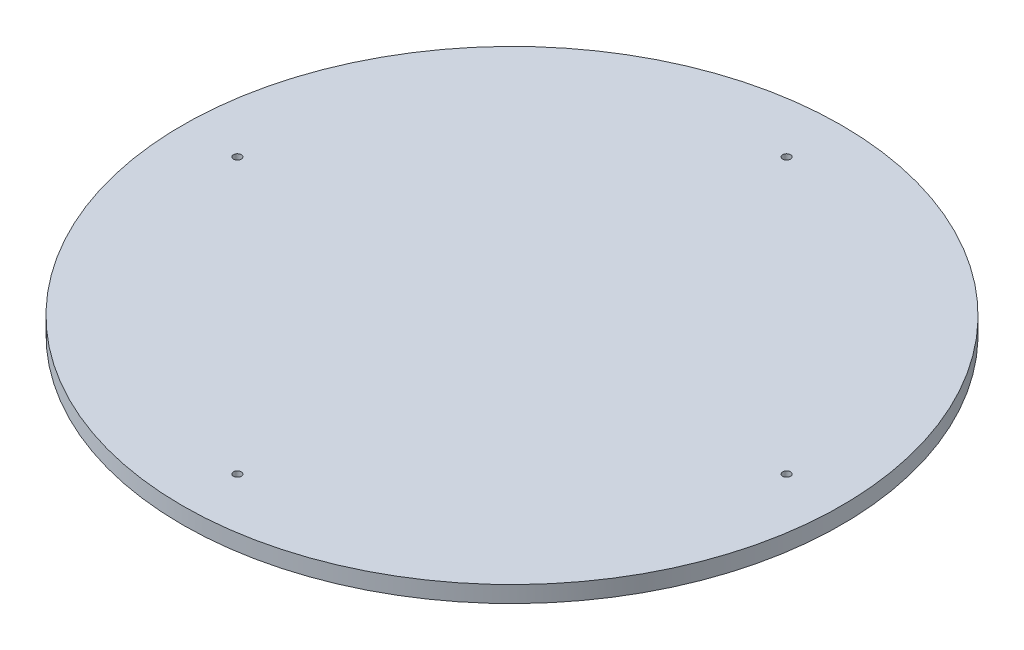
ISO-10303-21;
HEADER;
FILE_DESCRIPTION(('STEP AP214'),'2;1');
FILE_NAME('part.step','',(''),(''),'','','');
FILE_SCHEMA(('AUTOMOTIVE_DESIGN { 1 0 10303 214 1 1 1 1 }'));
ENDSEC;
DATA;
#1=APPLICATION_CONTEXT('core data for automotive mechanical design processes');
#2=APPLICATION_PROTOCOL_DEFINITION('international standard','automotive_design',2000,#1);
#3=PRODUCT_CONTEXT('',#1,'mechanical');
#4=PRODUCT('Part','Part','',(#3));
#5=PRODUCT_RELATED_PRODUCT_CATEGORY('part','',(#4));
#6=PRODUCT_DEFINITION_FORMATION('','',#4);
#7=PRODUCT_DEFINITION_CONTEXT('part definition',#1,'design');
#8=PRODUCT_DEFINITION('design','',#6,#7);
#9=PRODUCT_DEFINITION_SHAPE('','',#8);
#10=(LENGTH_UNIT() NAMED_UNIT(*) SI_UNIT(.MILLI.,.METRE.));
#11=(NAMED_UNIT(*) PLANE_ANGLE_UNIT() SI_UNIT($,.RADIAN.));
#12=(NAMED_UNIT(*) SI_UNIT($,.STERADIAN.) SOLID_ANGLE_UNIT());
#13=UNCERTAINTY_MEASURE_WITH_UNIT(LENGTH_MEASURE(1.E-05),#10,'distance_accuracy_value','');
#14=(GEOMETRIC_REPRESENTATION_CONTEXT(3) GLOBAL_UNCERTAINTY_ASSIGNED_CONTEXT((#13)) GLOBAL_UNIT_ASSIGNED_CONTEXT((#10,
#11,#12)) REPRESENTATION_CONTEXT('',''));
#15=CARTESIAN_POINT('',(0.,0.,0.));
#16=DIRECTION('',(0.,0.,1.));
#17=DIRECTION('',(1.,0.,0.));
#18=AXIS2_PLACEMENT_3D('',#15,#16,#17);
#19=CARTESIAN_POINT('',(0.,0.,0.));
#20=DIRECTION('',(0.,1.,0.));
#21=DIRECTION('',(0.,0.,1.));
#22=AXIS2_PLACEMENT_3D('',#19,#20,#21);
#23=PLANE('',#22);
#24=CARTESIAN_POINT('',(0.,0.,-250.));
#25=DIRECTION('',(0.,-1.,0.));
#26=DIRECTION('',(0.,0.,-1.));
#27=AXIS2_PLACEMENT_3D('',#24,#25,#26);
#28=CIRCLE('',#27,5.55625);
#29=CARTESIAN_POINT('',(0.,0.,-255.55625));
#30=VERTEX_POINT('',#29);
#31=EDGE_CURVE('E94',#30,#30,#28,.T.);
#32=ORIENTED_EDGE('',*,*,#31,.F.);
#33=EDGE_LOOP('',(#32));
#34=FACE_BOUND('',#33,.T.);
#35=CARTESIAN_POINT('',(250.000000000011,0.,-1.06122167814335E-11));
#36=DIRECTION('',(0.,-1.,0.));
#37=DIRECTION('',(0.,0.,-1.));
#38=AXIS2_PLACEMENT_3D('',#35,#36,#37);
#39=CIRCLE('',#38,5.55624999999998);
#40=CARTESIAN_POINT('',(250.000000000011,0.,-5.5562500000106));
#41=VERTEX_POINT('',#40);
#42=EDGE_CURVE('E82',#41,#41,#39,.T.);
#43=ORIENTED_EDGE('',*,*,#42,.F.);
#44=EDGE_LOOP('',(#43));
#45=FACE_BOUND('',#44,.T.);
#46=CARTESIAN_POINT('',(2.1224433562867E-11,0.,250.));
#47=DIRECTION('',(0.,-1.,0.));
#48=DIRECTION('',(0.,0.,-1.));
#49=AXIS2_PLACEMENT_3D('',#46,#47,#48);
#50=CIRCLE('',#49,5.55625);
#51=CARTESIAN_POINT('',(2.1224433562867E-11,0.,244.44375));
#52=VERTEX_POINT('',#51);
#53=EDGE_CURVE('E70',#52,#52,#50,.T.);
#54=ORIENTED_EDGE('',*,*,#53,.F.);
#55=EDGE_LOOP('',(#54));
#56=FACE_BOUND('',#55,.T.);
#57=CARTESIAN_POINT('',(0.,0.,0.));
#58=DIRECTION('',(0.,1.,0.));
#59=DIRECTION('',(0.,0.,1.));
#60=AXIS2_PLACEMENT_3D('',#57,#58,#59);
#61=CIRCLE('',#60,300.);
#62=CARTESIAN_POINT('',(0.,0.,300.));
#63=VERTEX_POINT('',#62);
#64=EDGE_CURVE('E41',#63,#63,#61,.T.);
#65=ORIENTED_EDGE('',*,*,#64,.F.);
#66=EDGE_LOOP('',(#65));
#67=FACE_BOUND('',#66,.T.);
#68=CARTESIAN_POINT('',(-249.999999999989,0.,1.05816006114548E-11));
#69=DIRECTION('',(0.,-1.,0.));
#70=DIRECTION('',(0.,0.,-1.));
#71=AXIS2_PLACEMENT_3D('',#68,#69,#70);
#72=CIRCLE('',#71,5.55625000000001);
#73=CARTESIAN_POINT('',(-249.999999999989,0.,-5.55624999998943));
#74=VERTEX_POINT('',#73);
#75=EDGE_CURVE('E58',#74,#74,#72,.T.);
#76=ORIENTED_EDGE('',*,*,#75,.F.);
#77=EDGE_LOOP('',(#76));
#78=FACE_BOUND('',#77,.T.);
#79=ADVANCED_FACE('F37',(#34,#45,#56,#67,#78),#23,.F.);
#80=CARTESIAN_POINT('',(0.,15.,0.));
#81=DIRECTION('',(0.,-1.,0.));
#82=DIRECTION('',(0.,0.,-1.));
#83=AXIS2_PLACEMENT_3D('',#80,#81,#82);
#84=CYLINDRICAL_SURFACE('',#83,300.);
#85=CARTESIAN_POINT('',(0.,15.,0.));
#86=DIRECTION('',(0.,1.,0.));
#87=DIRECTION('',(0.,0.,1.));
#88=AXIS2_PLACEMENT_3D('',#85,#86,#87);
#89=CIRCLE('',#88,300.);
#90=CARTESIAN_POINT('',(0.,15.,300.));
#91=VERTEX_POINT('',#90);
#92=EDGE_CURVE('E10',#91,#91,#89,.T.);
#93=ORIENTED_EDGE('',*,*,#92,.F.);
#94=EDGE_LOOP('',(#93));
#95=FACE_BOUND('',#94,.T.);
#96=ORIENTED_EDGE('',*,*,#64,.T.);
#97=EDGE_LOOP('',(#96));
#98=FACE_BOUND('',#97,.T.);
#99=ADVANCED_FACE('F39',(#95,#98),#84,.T.);
#100=CARTESIAN_POINT('',(0.,15.,0.));
#101=DIRECTION('',(0.,1.,0.));
#102=DIRECTION('',(0.,0.,1.));
#103=AXIS2_PLACEMENT_3D('',#100,#101,#102);
#104=PLANE('',#103);
#105=CARTESIAN_POINT('',(0.,15.,-250.));
#106=DIRECTION('',(0.,-1.,0.));
#107=DIRECTION('',(0.,0.,-1.));
#108=AXIS2_PLACEMENT_3D('',#105,#106,#107);
#109=CIRCLE('',#108,3.57124);
#110=CARTESIAN_POINT('',(0.,15.,-253.57124));
#111=VERTEX_POINT('',#110);
#112=EDGE_CURVE('E85',#111,#111,#109,.T.);
#113=ORIENTED_EDGE('',*,*,#112,.T.);
#114=EDGE_LOOP('',(#113));
#115=FACE_BOUND('',#114,.T.);
#116=CARTESIAN_POINT('',(250.000000000011,15.,-1.06122167814335E-11));
#117=DIRECTION('',(0.,-1.,0.));
#118=DIRECTION('',(0.,0.,-1.));
#119=AXIS2_PLACEMENT_3D('',#116,#117,#118);
#120=CIRCLE('',#119,3.57123999999998);
#121=CARTESIAN_POINT('',(250.000000000011,15.,-3.57124000001059));
#122=VERTEX_POINT('',#121);
#123=EDGE_CURVE('E73',#122,#122,#120,.T.);
#124=ORIENTED_EDGE('',*,*,#123,.T.);
#125=EDGE_LOOP('',(#124));
#126=FACE_BOUND('',#125,.T.);
#127=CARTESIAN_POINT('',(2.1224433562867E-11,15.,250.));
#128=DIRECTION('',(0.,-1.,0.));
#129=DIRECTION('',(0.,0.,-1.));
#130=AXIS2_PLACEMENT_3D('',#127,#128,#129);
#131=CIRCLE('',#130,3.57124);
#132=CARTESIAN_POINT('',(2.1224433562867E-11,15.,246.42876));
#133=VERTEX_POINT('',#132);
#134=EDGE_CURVE('E61',#133,#133,#131,.T.);
#135=ORIENTED_EDGE('',*,*,#134,.T.);
#136=EDGE_LOOP('',(#135));
#137=FACE_BOUND('',#136,.T.);
#138=CARTESIAN_POINT('',(-249.999999999989,15.,1.05816006114548E-11));
#139=DIRECTION('',(0.,-1.,0.));
#140=DIRECTION('',(0.,0.,-1.));
#141=AXIS2_PLACEMENT_3D('',#138,#139,#140);
#142=CIRCLE('',#141,3.57124);
#143=CARTESIAN_POINT('',(-249.999999999989,15.,-3.57123999998942));
#144=VERTEX_POINT('',#143);
#145=EDGE_CURVE('E48',#144,#144,#142,.T.);
#146=ORIENTED_EDGE('',*,*,#145,.T.);
#147=EDGE_LOOP('',(#146));
#148=FACE_BOUND('',#147,.T.);
#149=ORIENTED_EDGE('',*,*,#92,.T.);
#150=EDGE_LOOP('',(#149));
#151=FACE_BOUND('',#150,.T.);
#152=ADVANCED_FACE('F131',(#115,#126,#137,#148,#151),#104,.T.);
#153=CARTESIAN_POINT('',(-249.999999999989,0.,1.05816006114548E-11));
#154=DIRECTION('',(0.,-1.,0.));
#155=DIRECTION('',(0.,0.,-1.));
#156=AXIS2_PLACEMENT_3D('',#153,#154,#155);
#157=CYLINDRICAL_SURFACE('',#156,3.57124);
#158=ORIENTED_EDGE('',*,*,#145,.F.);
#159=EDGE_LOOP('',(#158));
#160=FACE_BOUND('',#159,.T.);
#161=CARTESIAN_POINT('',(-249.999999999989,6.35,1.05816006114548E-11));
#162=DIRECTION('',(0.,-1.,0.));
#163=DIRECTION('',(0.,0.,-1.));
#164=AXIS2_PLACEMENT_3D('',#161,#162,#163);
#165=CIRCLE('',#164,3.57124);
#166=CARTESIAN_POINT('',(-249.999999999989,6.35,-3.57123999998942));
#167=VERTEX_POINT('',#166);
#168=EDGE_CURVE('E52',#167,#167,#165,.T.);
#169=ORIENTED_EDGE('',*,*,#168,.T.);
#170=EDGE_LOOP('',(#169));
#171=FACE_BOUND('',#170,.T.);
#172=ADVANCED_FACE('F123',(#160,#171),#157,.F.);
#173=CARTESIAN_POINT('',(-246.428759999989,6.35,1.05816006114548E-11));
#174=DIRECTION('',(0.,1.,0.));
#175=DIRECTION('',(0.,0.,1.));
#176=AXIS2_PLACEMENT_3D('',#173,#174,#175);
#177=PLANE('',#176);
#178=ORIENTED_EDGE('',*,*,#168,.F.);
#179=EDGE_LOOP('',(#178));
#180=FACE_BOUND('',#179,.T.);
#181=CARTESIAN_POINT('',(-249.999999999989,6.35,1.05816006114548E-11));
#182=DIRECTION('',(0.,-1.,0.));
#183=DIRECTION('',(0.,0.,-1.));
#184=AXIS2_PLACEMENT_3D('',#181,#182,#183);
#185=CIRCLE('',#184,5.55624999999998);
#186=CARTESIAN_POINT('',(-249.999999999989,6.35,-5.5562499999894));
#187=VERTEX_POINT('',#186);
#188=EDGE_CURVE('E55',#187,#187,#185,.T.);
#189=ORIENTED_EDGE('',*,*,#188,.T.);
#190=EDGE_LOOP('',(#189));
#191=FACE_BOUND('',#190,.T.);
#192=ADVANCED_FACE('F113',(#180,#191),#177,.F.);
#193=CARTESIAN_POINT('',(-249.999999999989,0.,1.05816006114548E-11));
#194=DIRECTION('',(0.,-1.,0.));
#195=DIRECTION('',(0.,0.,-1.));
#196=AXIS2_PLACEMENT_3D('',#193,#194,#195);
#197=CYLINDRICAL_SURFACE('',#196,5.55625);
#198=ORIENTED_EDGE('',*,*,#188,.F.);
#199=EDGE_LOOP('',(#198));
#200=FACE_BOUND('',#199,.T.);
#201=ORIENTED_EDGE('',*,*,#75,.T.);
#202=EDGE_LOOP('',(#201));
#203=FACE_BOUND('',#202,.T.);
#204=ADVANCED_FACE('F110',(#200,#203),#197,.F.);
#205=CARTESIAN_POINT('',(2.1224433562867E-11,0.,250.));
#206=DIRECTION('',(0.,-1.,0.));
#207=DIRECTION('',(0.,0.,-1.));
#208=AXIS2_PLACEMENT_3D('',#205,#206,#207);
#209=CYLINDRICAL_SURFACE('',#208,3.57124);
#210=ORIENTED_EDGE('',*,*,#134,.F.);
#211=EDGE_LOOP('',(#210));
#212=FACE_BOUND('',#211,.T.);
#213=CARTESIAN_POINT('',(2.1224433562867E-11,6.35,250.));
#214=DIRECTION('',(0.,-1.,0.));
#215=DIRECTION('',(0.,0.,-1.));
#216=AXIS2_PLACEMENT_3D('',#213,#214,#215);
#217=CIRCLE('',#216,3.57124);
#218=CARTESIAN_POINT('',(2.1224433562867E-11,6.35,246.42876));
#219=VERTEX_POINT('',#218);
#220=EDGE_CURVE('E64',#219,#219,#217,.T.);
#221=ORIENTED_EDGE('',*,*,#220,.T.);
#222=EDGE_LOOP('',(#221));
#223=FACE_BOUND('',#222,.T.);
#224=ADVANCED_FACE('F112',(#212,#223),#209,.F.);
#225=CARTESIAN_POINT('',(3.57124000002122,6.35,250.));
#226=DIRECTION('',(0.,1.,0.));
#227=DIRECTION('',(0.,0.,1.));
#228=AXIS2_PLACEMENT_3D('',#225,#226,#227);
#229=PLANE('',#228);
#230=ORIENTED_EDGE('',*,*,#220,.F.);
#231=EDGE_LOOP('',(#230));
#232=FACE_BOUND('',#231,.T.);
#233=CARTESIAN_POINT('',(2.1224433562867E-11,6.35,250.));
#234=DIRECTION('',(0.,-1.,0.));
#235=DIRECTION('',(0.,0.,-1.));
#236=AXIS2_PLACEMENT_3D('',#233,#234,#235);
#237=CIRCLE('',#236,5.55625);
#238=CARTESIAN_POINT('',(2.1224433562867E-11,6.35,244.44375));
#239=VERTEX_POINT('',#238);
#240=EDGE_CURVE('E67',#239,#239,#237,.T.);
#241=ORIENTED_EDGE('',*,*,#240,.T.);
#242=EDGE_LOOP('',(#241));
#243=FACE_BOUND('',#242,.T.);
#244=ADVANCED_FACE('F120',(#232,#243),#229,.F.);
#245=CARTESIAN_POINT('',(2.1224433562867E-11,0.,250.));
#246=DIRECTION('',(0.,-1.,0.));
#247=DIRECTION('',(0.,0.,-1.));
#248=AXIS2_PLACEMENT_3D('',#245,#246,#247);
#249=CYLINDRICAL_SURFACE('',#248,5.55625);
#250=ORIENTED_EDGE('',*,*,#240,.F.);
#251=EDGE_LOOP('',(#250));
#252=FACE_BOUND('',#251,.T.);
#253=ORIENTED_EDGE('',*,*,#53,.T.);
#254=EDGE_LOOP('',(#253));
#255=FACE_BOUND('',#254,.T.);
#256=ADVANCED_FACE('F154',(#252,#255),#249,.F.);
#257=CARTESIAN_POINT('',(250.000000000011,0.,-1.06122167814335E-11));
#258=DIRECTION('',(0.,-1.,0.));
#259=DIRECTION('',(0.,0.,-1.));
#260=AXIS2_PLACEMENT_3D('',#257,#258,#259);
#261=CYLINDRICAL_SURFACE('',#260,3.57123999999998);
#262=ORIENTED_EDGE('',*,*,#123,.F.);
#263=EDGE_LOOP('',(#262));
#264=FACE_BOUND('',#263,.T.);
#265=CARTESIAN_POINT('',(250.000000000011,6.35,-1.06122167814335E-11));
#266=DIRECTION('',(0.,-1.,0.));
#267=DIRECTION('',(0.,0.,-1.));
#268=AXIS2_PLACEMENT_3D('',#265,#266,#267);
#269=CIRCLE('',#268,3.57123999999998);
#270=CARTESIAN_POINT('',(250.000000000011,6.35,-3.57124000001059));
#271=VERTEX_POINT('',#270);
#272=EDGE_CURVE('E76',#271,#271,#269,.T.);
#273=ORIENTED_EDGE('',*,*,#272,.T.);
#274=EDGE_LOOP('',(#273));
#275=FACE_BOUND('',#274,.T.);
#276=ADVANCED_FACE('F159',(#264,#275),#261,.F.);
#277=CARTESIAN_POINT('',(253.571240000011,6.35,-1.06122167814335E-11));
#278=DIRECTION('',(0.,1.,0.));
#279=DIRECTION('',(0.,0.,1.));
#280=AXIS2_PLACEMENT_3D('',#277,#278,#279);
#281=PLANE('',#280);
#282=ORIENTED_EDGE('',*,*,#272,.F.);
#283=EDGE_LOOP('',(#282));
#284=FACE_BOUND('',#283,.T.);
#285=CARTESIAN_POINT('',(250.000000000011,6.35,-1.06122167814335E-11));
#286=DIRECTION('',(0.,-1.,0.));
#287=DIRECTION('',(0.,0.,-1.));
#288=AXIS2_PLACEMENT_3D('',#285,#286,#287);
#289=CIRCLE('',#288,5.55624999999998);
#290=CARTESIAN_POINT('',(250.000000000011,6.35,-5.5562500000106));
#291=VERTEX_POINT('',#290);
#292=EDGE_CURVE('E79',#291,#291,#289,.T.);
#293=ORIENTED_EDGE('',*,*,#292,.T.);
#294=EDGE_LOOP('',(#293));
#295=FACE_BOUND('',#294,.T.);
#296=ADVANCED_FACE('F164',(#284,#295),#281,.F.);
#297=CARTESIAN_POINT('',(250.000000000011,0.,-1.06122167814335E-11));
#298=DIRECTION('',(0.,-1.,0.));
#299=DIRECTION('',(0.,0.,-1.));
#300=AXIS2_PLACEMENT_3D('',#297,#298,#299);
#301=CYLINDRICAL_SURFACE('',#300,5.55624999999998);
#302=ORIENTED_EDGE('',*,*,#292,.F.);
#303=EDGE_LOOP('',(#302));
#304=FACE_BOUND('',#303,.T.);
#305=ORIENTED_EDGE('',*,*,#42,.T.);
#306=EDGE_LOOP('',(#305));
#307=FACE_BOUND('',#306,.T.);
#308=ADVANCED_FACE('F170',(#304,#307),#301,.F.);
#309=CARTESIAN_POINT('',(0.,0.,-250.));
#310=DIRECTION('',(0.,-1.,0.));
#311=DIRECTION('',(0.,0.,-1.));
#312=AXIS2_PLACEMENT_3D('',#309,#310,#311);
#313=CYLINDRICAL_SURFACE('',#312,3.57124);
#314=ORIENTED_EDGE('',*,*,#112,.F.);
#315=EDGE_LOOP('',(#314));
#316=FACE_BOUND('',#315,.T.);
#317=CARTESIAN_POINT('',(0.,6.35,-250.));
#318=DIRECTION('',(0.,-1.,0.));
#319=DIRECTION('',(0.,0.,-1.));
#320=AXIS2_PLACEMENT_3D('',#317,#318,#319);
#321=CIRCLE('',#320,3.57124);
#322=CARTESIAN_POINT('',(0.,6.35,-253.57124));
#323=VERTEX_POINT('',#322);
#324=EDGE_CURVE('E88',#323,#323,#321,.T.);
#325=ORIENTED_EDGE('',*,*,#324,.T.);
#326=EDGE_LOOP('',(#325));
#327=FACE_BOUND('',#326,.T.);
#328=ADVANCED_FACE('F174',(#316,#327),#313,.F.);
#329=CARTESIAN_POINT('',(3.57124,6.35,-250.));
#330=DIRECTION('',(0.,1.,0.));
#331=DIRECTION('',(0.,0.,1.));
#332=AXIS2_PLACEMENT_3D('',#329,#330,#331);
#333=PLANE('',#332);
#334=ORIENTED_EDGE('',*,*,#324,.F.);
#335=EDGE_LOOP('',(#334));
#336=FACE_BOUND('',#335,.T.);
#337=CARTESIAN_POINT('',(0.,6.35,-250.));
#338=DIRECTION('',(0.,-1.,0.));
#339=DIRECTION('',(0.,0.,-1.));
#340=AXIS2_PLACEMENT_3D('',#337,#338,#339);
#341=CIRCLE('',#340,5.55625);
#342=CARTESIAN_POINT('',(0.,6.35,-255.55625));
#343=VERTEX_POINT('',#342);
#344=EDGE_CURVE('E91',#343,#343,#341,.T.);
#345=ORIENTED_EDGE('',*,*,#344,.T.);
#346=EDGE_LOOP('',(#345));
#347=FACE_BOUND('',#346,.T.);
#348=ADVANCED_FACE('F178',(#336,#347),#333,.F.);
#349=CARTESIAN_POINT('',(0.,0.,-250.));
#350=DIRECTION('',(0.,-1.,0.));
#351=DIRECTION('',(0.,0.,-1.));
#352=AXIS2_PLACEMENT_3D('',#349,#350,#351);
#353=CYLINDRICAL_SURFACE('',#352,5.55625);
#354=ORIENTED_EDGE('',*,*,#344,.F.);
#355=EDGE_LOOP('',(#354));
#356=FACE_BOUND('',#355,.T.);
#357=ORIENTED_EDGE('',*,*,#31,.T.);
#358=EDGE_LOOP('',(#357));
#359=FACE_BOUND('',#358,.T.);
#360=ADVANCED_FACE('F98',(#356,#359),#353,.F.);
#361=CLOSED_SHELL('',(#79,#99,#152,#172,#192,#204,#224,#244,#256,#276,#296,#308,#328,#348,#360));
#362=MANIFOLD_SOLID_BREP('B2',#361);
#363=ADVANCED_BREP_SHAPE_REPRESENTATION('',(#18,#362),#14);
#364=SHAPE_DEFINITION_REPRESENTATION(#9,#363);
ENDSEC;
END-ISO-10303-21;
